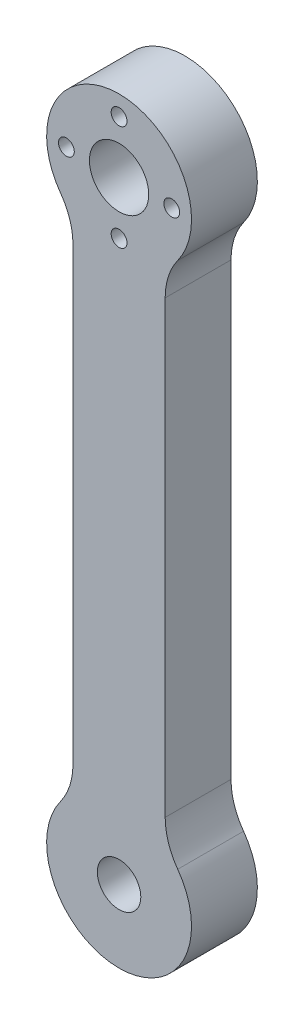
ISO-10303-21;
HEADER;
FILE_DESCRIPTION(('STEP AP214'),'2;1');
FILE_NAME('part.step','',(''),(''),'','','');
FILE_SCHEMA(('AUTOMOTIVE_DESIGN { 1 0 10303 214 1 1 1 1 }'));
ENDSEC;
DATA;
#1=APPLICATION_CONTEXT('core data for automotive mechanical design processes');
#2=APPLICATION_PROTOCOL_DEFINITION('international standard','automotive_design',2000,#1);
#3=PRODUCT_CONTEXT('',#1,'mechanical');
#4=PRODUCT('Part','Part','',(#3));
#5=PRODUCT_RELATED_PRODUCT_CATEGORY('part','',(#4));
#6=PRODUCT_DEFINITION_FORMATION('','',#4);
#7=PRODUCT_DEFINITION_CONTEXT('part definition',#1,'design');
#8=PRODUCT_DEFINITION('design','',#6,#7);
#9=PRODUCT_DEFINITION_SHAPE('','',#8);
#10=(LENGTH_UNIT() NAMED_UNIT(*) SI_UNIT(.MILLI.,.METRE.));
#11=(NAMED_UNIT(*) PLANE_ANGLE_UNIT() SI_UNIT($,.RADIAN.));
#12=(NAMED_UNIT(*) SI_UNIT($,.STERADIAN.) SOLID_ANGLE_UNIT());
#13=UNCERTAINTY_MEASURE_WITH_UNIT(LENGTH_MEASURE(1.E-05),#10,'distance_accuracy_value','');
#14=(GEOMETRIC_REPRESENTATION_CONTEXT(3) GLOBAL_UNCERTAINTY_ASSIGNED_CONTEXT((#13)) GLOBAL_UNIT_ASSIGNED_CONTEXT((#10,
#11,#12)) REPRESENTATION_CONTEXT('',''));
#15=CARTESIAN_POINT('',(0.,0.,0.));
#16=DIRECTION('',(0.,0.,1.));
#17=DIRECTION('',(1.,0.,0.));
#18=AXIS2_PLACEMENT_3D('',#15,#16,#17);
#19=CARTESIAN_POINT('',(0.,46.4852813742386,10.));
#20=DIRECTION('',(0.,0.,1.));
#21=DIRECTION('',(1.,0.,0.));
#22=AXIS2_PLACEMENT_3D('',#19,#20,#21);
#23=PLANE('',#22);
#24=CARTESIAN_POINT('',(0.,-46.4852813742386,10.));
#25=DIRECTION('',(0.,0.,1.));
#26=DIRECTION('',(1.,0.,0.));
#27=AXIS2_PLACEMENT_3D('',#24,#25,#26);
#28=CIRCLE('',#27,3.3);
#29=CARTESIAN_POINT('',(3.3,-46.4852813742386,10.));
#30=VERTEX_POINT('',#29);
#31=EDGE_CURVE('E373',#30,#30,#28,.T.);
#32=ORIENTED_EDGE('',*,*,#31,.F.);
#33=EDGE_LOOP('',(#32));
#34=FACE_BOUND('',#33,.T.);
#35=CARTESIAN_POINT('',(0.,54.4852813742386,10.));
#36=DIRECTION('',(0.,0.,1.));
#37=DIRECTION('',(1.,0.,0.));
#38=AXIS2_PLACEMENT_3D('',#35,#36,#37);
#39=CIRCLE('',#38,1.19999999999999);
#40=CARTESIAN_POINT('',(1.19999999999999,54.4852813742386,10.));
#41=VERTEX_POINT('',#40);
#42=EDGE_CURVE('E364',#41,#41,#39,.T.);
#43=ORIENTED_EDGE('',*,*,#42,.F.);
#44=EDGE_LOOP('',(#43));
#45=FACE_BOUND('',#44,.T.);
#46=CARTESIAN_POINT('',(8.,46.4852813742386,10.));
#47=DIRECTION('',(0.,0.,1.));
#48=DIRECTION('',(1.,0.,0.));
#49=AXIS2_PLACEMENT_3D('',#46,#47,#48);
#50=CIRCLE('',#49,1.19999999999999);
#51=CARTESIAN_POINT('',(9.19999999999999,46.4852813742386,10.));
#52=VERTEX_POINT('',#51);
#53=EDGE_CURVE('E370',#52,#52,#50,.T.);
#54=ORIENTED_EDGE('',*,*,#53,.F.);
#55=EDGE_LOOP('',(#54));
#56=FACE_BOUND('',#55,.T.);
#57=CARTESIAN_POINT('',(0.,38.4852813742386,10.));
#58=DIRECTION('',(0.,0.,1.));
#59=DIRECTION('',(1.,0.,0.));
#60=AXIS2_PLACEMENT_3D('',#57,#58,#59);
#61=CIRCLE('',#60,1.19999999999999);
#62=CARTESIAN_POINT('',(1.19999999999999,38.4852813742386,10.));
#63=VERTEX_POINT('',#62);
#64=EDGE_CURVE('E384',#63,#63,#61,.T.);
#65=ORIENTED_EDGE('',*,*,#64,.F.);
#66=EDGE_LOOP('',(#65));
#67=FACE_BOUND('',#66,.T.);
#68=CARTESIAN_POINT('',(-8.,46.4852813742386,10.));
#69=DIRECTION('',(0.,0.,1.));
#70=DIRECTION('',(1.,0.,0.));
#71=AXIS2_PLACEMENT_3D('',#68,#69,#70);
#72=CIRCLE('',#71,1.19999999999999);
#73=CARTESIAN_POINT('',(-6.80000000000001,46.4852813742386,10.));
#74=VERTEX_POINT('',#73);
#75=EDGE_CURVE('E392',#74,#74,#72,.T.);
#76=ORIENTED_EDGE('',*,*,#75,.F.);
#77=EDGE_LOOP('',(#76));
#78=FACE_BOUND('',#77,.T.);
#79=DIRECTION('',(0.,1.,0.));
#80=VECTOR('',#79,1.);
#81=CARTESIAN_POINT('',(6.99999999999998,38.,10.));
#82=LINE('',#81,#80);
#83=CARTESIAN_POINT('',(6.99999999999998,-34.1564533683006,10.));
#84=VERTEX_POINT('',#83);
#85=CARTESIAN_POINT('',(6.99999999999998,34.1564533683006,10.));
#86=VERTEX_POINT('',#85);
#87=EDGE_CURVE('E157',#84,#86,#82,.T.);
#88=ORIENTED_EDGE('',*,*,#87,.T.);
#89=CARTESIAN_POINT('',(17.,34.1564533683006,10.));
#90=DIRECTION('',(0.,0.,1.));
#91=DIRECTION('',(1.,0.,0.));
#92=AXIS2_PLACEMENT_3D('',#89,#90,#91);
#93=CIRCLE('',#92,10.);
#94=CARTESIAN_POINT('',(8.90476190476189,40.0273238473187,10.));
#95=VERTEX_POINT('',#94);
#96=EDGE_CURVE('E68',#86,#95,#93,.F.);
#97=ORIENTED_EDGE('',*,*,#96,.T.);
#98=CARTESIAN_POINT('',(0.,46.4852813742386,10.));
#99=DIRECTION('',(0.,0.,1.));
#100=DIRECTION('',(1.,0.,0.));
#101=AXIS2_PLACEMENT_3D('',#98,#99,#100);
#102=CIRCLE('',#101,11.);
#103=CARTESIAN_POINT('',(-8.90476190476189,40.0273238473187,10.));
#104=VERTEX_POINT('',#103);
#105=EDGE_CURVE('E150',#95,#104,#102,.T.);
#106=ORIENTED_EDGE('',*,*,#105,.T.);
#107=CARTESIAN_POINT('',(-17.,34.1564533683006,10.));
#108=DIRECTION('',(0.,0.,1.));
#109=DIRECTION('',(1.,0.,0.));
#110=AXIS2_PLACEMENT_3D('',#107,#108,#109);
#111=CIRCLE('',#110,10.);
#112=CARTESIAN_POINT('',(-6.99999999999998,34.1564533683006,10.));
#113=VERTEX_POINT('',#112);
#114=EDGE_CURVE('E11',#104,#113,#111,.F.);
#115=ORIENTED_EDGE('',*,*,#114,.T.);
#116=DIRECTION('',(0.,-1.,0.));
#117=VECTOR('',#116,1.);
#118=CARTESIAN_POINT('',(-6.99999999999998,38.,10.));
#119=LINE('',#118,#117);
#120=CARTESIAN_POINT('',(-6.99999999999998,-34.1564533683006,10.));
#121=VERTEX_POINT('',#120);
#122=EDGE_CURVE('E198',#113,#121,#119,.T.);
#123=ORIENTED_EDGE('',*,*,#122,.T.);
#124=CARTESIAN_POINT('',(-17.,-34.1564533683006,10.));
#125=DIRECTION('',(0.,0.,1.));
#126=DIRECTION('',(1.,0.,0.));
#127=AXIS2_PLACEMENT_3D('',#124,#125,#126);
#128=CIRCLE('',#127,10.);
#129=CARTESIAN_POINT('',(-8.90476190476189,-40.0273238473187,10.));
#130=VERTEX_POINT('',#129);
#131=EDGE_CURVE('E123',#121,#130,#128,.F.);
#132=ORIENTED_EDGE('',*,*,#131,.T.);
#133=CARTESIAN_POINT('',(0.,-46.4852813742386,10.));
#134=DIRECTION('',(0.,0.,1.));
#135=DIRECTION('',(-1.,0.,0.));
#136=AXIS2_PLACEMENT_3D('',#133,#134,#135);
#137=CIRCLE('',#136,11.);
#138=CARTESIAN_POINT('',(8.90476190476189,-40.0273238473187,10.));
#139=VERTEX_POINT('',#138);
#140=EDGE_CURVE('E133',#130,#139,#137,.T.);
#141=ORIENTED_EDGE('',*,*,#140,.T.);
#142=CARTESIAN_POINT('',(17.,-34.1564533683006,10.));
#143=DIRECTION('',(0.,0.,1.));
#144=DIRECTION('',(1.,0.,0.));
#145=AXIS2_PLACEMENT_3D('',#142,#143,#144);
#146=CIRCLE('',#145,10.);
#147=EDGE_CURVE('E180',#139,#84,#146,.F.);
#148=ORIENTED_EDGE('',*,*,#147,.T.);
#149=EDGE_LOOP('',(#88,#97,#106,#115,#123,#132,#141,#148));
#150=FACE_BOUND('',#149,.T.);
#151=CARTESIAN_POINT('',(0.,46.4852813742386,10.));
#152=DIRECTION('',(0.,0.,1.));
#153=DIRECTION('',(1.,0.,0.));
#154=AXIS2_PLACEMENT_3D('',#151,#152,#153);
#155=CIRCLE('',#154,4.50263545763704);
#156=CARTESIAN_POINT('',(4.50263545763704,46.4852813742386,10.));
#157=VERTEX_POINT('',#156);
#158=EDGE_CURVE('E193',#157,#157,#155,.T.);
#159=ORIENTED_EDGE('',*,*,#158,.F.);
#160=EDGE_LOOP('',(#159));
#161=FACE_BOUND('',#160,.T.);
#162=ADVANCED_FACE('F45',(#34,#45,#56,#67,#78,#150,#161),#23,.T.);
#163=CARTESIAN_POINT('',(0.,46.4852813742386,0.));
#164=DIRECTION('',(0.,0.,1.));
#165=DIRECTION('',(1.,0.,0.));
#166=AXIS2_PLACEMENT_3D('',#163,#164,#165);
#167=PLANE('',#166);
#168=CARTESIAN_POINT('',(0.,-46.4852813742386,0.));
#169=DIRECTION('',(0.,0.,1.));
#170=DIRECTION('',(1.,0.,0.));
#171=AXIS2_PLACEMENT_3D('',#168,#169,#170);
#172=CIRCLE('',#171,3.3);
#173=CARTESIAN_POINT('',(3.3,-46.4852813742386,0.));
#174=VERTEX_POINT('',#173);
#175=EDGE_CURVE('E366',#174,#174,#172,.T.);
#176=ORIENTED_EDGE('',*,*,#175,.T.);
#177=EDGE_LOOP('',(#176));
#178=FACE_BOUND('',#177,.T.);
#179=CARTESIAN_POINT('',(0.,54.4852813742386,0.));
#180=DIRECTION('',(0.,0.,1.));
#181=DIRECTION('',(1.,0.,0.));
#182=AXIS2_PLACEMENT_3D('',#179,#180,#181);
#183=CIRCLE('',#182,1.19999999999999);
#184=CARTESIAN_POINT('',(1.19999999999999,54.4852813742386,0.));
#185=VERTEX_POINT('',#184);
#186=EDGE_CURVE('E361',#185,#185,#183,.T.);
#187=ORIENTED_EDGE('',*,*,#186,.T.);
#188=EDGE_LOOP('',(#187));
#189=FACE_BOUND('',#188,.T.);
#190=CARTESIAN_POINT('',(8.,46.4852813742386,0.));
#191=DIRECTION('',(0.,0.,1.));
#192=DIRECTION('',(1.,0.,0.));
#193=AXIS2_PLACEMENT_3D('',#190,#191,#192);
#194=CIRCLE('',#193,1.19999999999999);
#195=CARTESIAN_POINT('',(9.19999999999999,46.4852813742386,0.));
#196=VERTEX_POINT('',#195);
#197=EDGE_CURVE('E380',#196,#196,#194,.T.);
#198=ORIENTED_EDGE('',*,*,#197,.T.);
#199=EDGE_LOOP('',(#198));
#200=FACE_BOUND('',#199,.T.);
#201=CARTESIAN_POINT('',(0.,38.4852813742386,0.));
#202=DIRECTION('',(0.,0.,1.));
#203=DIRECTION('',(1.,0.,0.));
#204=AXIS2_PLACEMENT_3D('',#201,#202,#203);
#205=CIRCLE('',#204,1.19999999999999);
#206=CARTESIAN_POINT('',(1.19999999999999,38.4852813742386,0.));
#207=VERTEX_POINT('',#206);
#208=EDGE_CURVE('E388',#207,#207,#205,.T.);
#209=ORIENTED_EDGE('',*,*,#208,.T.);
#210=EDGE_LOOP('',(#209));
#211=FACE_BOUND('',#210,.T.);
#212=CARTESIAN_POINT('',(-8.,46.4852813742386,0.));
#213=DIRECTION('',(0.,0.,1.));
#214=DIRECTION('',(1.,0.,0.));
#215=AXIS2_PLACEMENT_3D('',#212,#213,#214);
#216=CIRCLE('',#215,1.19999999999999);
#217=CARTESIAN_POINT('',(-6.80000000000001,46.4852813742386,0.));
#218=VERTEX_POINT('',#217);
#219=EDGE_CURVE('E396',#218,#218,#216,.T.);
#220=ORIENTED_EDGE('',*,*,#219,.T.);
#221=EDGE_LOOP('',(#220));
#222=FACE_BOUND('',#221,.T.);
#223=CARTESIAN_POINT('',(0.,46.4852813742386,0.));
#224=DIRECTION('',(0.,0.,1.));
#225=DIRECTION('',(1.,0.,0.));
#226=AXIS2_PLACEMENT_3D('',#223,#224,#225);
#227=CIRCLE('',#226,11.);
#228=CARTESIAN_POINT('',(8.90476190476189,40.0273238473187,0.));
#229=VERTEX_POINT('',#228);
#230=CARTESIAN_POINT('',(-8.90476190476189,40.0273238473187,0.));
#231=VERTEX_POINT('',#230);
#232=EDGE_CURVE('E152',#229,#231,#227,.T.);
#233=ORIENTED_EDGE('',*,*,#232,.F.);
#234=CARTESIAN_POINT('',(17.,34.1564533683006,0.));
#235=DIRECTION('',(0.,0.,1.));
#236=DIRECTION('',(1.,0.,0.));
#237=AXIS2_PLACEMENT_3D('',#234,#235,#236);
#238=CIRCLE('',#237,10.);
#239=CARTESIAN_POINT('',(6.99999999999998,34.1564533683006,0.));
#240=VERTEX_POINT('',#239);
#241=EDGE_CURVE('E183',#229,#240,#238,.T.);
#242=ORIENTED_EDGE('',*,*,#241,.T.);
#243=DIRECTION('',(0.,1.,0.));
#244=VECTOR('',#243,1.);
#245=CARTESIAN_POINT('',(6.99999999999998,38.,0.));
#246=LINE('',#245,#244);
#247=CARTESIAN_POINT('',(6.99999999999998,-34.1564533683006,0.));
#248=VERTEX_POINT('',#247);
#249=EDGE_CURVE('E144',#248,#240,#246,.T.);
#250=ORIENTED_EDGE('',*,*,#249,.F.);
#251=CARTESIAN_POINT('',(17.,-34.1564533683006,0.));
#252=DIRECTION('',(0.,0.,1.));
#253=DIRECTION('',(1.,0.,0.));
#254=AXIS2_PLACEMENT_3D('',#251,#252,#253);
#255=CIRCLE('',#254,10.);
#256=CARTESIAN_POINT('',(8.90476190476189,-40.0273238473187,0.));
#257=VERTEX_POINT('',#256);
#258=EDGE_CURVE('E142',#248,#257,#255,.T.);
#259=ORIENTED_EDGE('',*,*,#258,.T.);
#260=CARTESIAN_POINT('',(0.,-46.4852813742386,0.));
#261=DIRECTION('',(0.,0.,1.));
#262=DIRECTION('',(-1.,0.,0.));
#263=AXIS2_PLACEMENT_3D('',#260,#261,#262);
#264=CIRCLE('',#263,11.);
#265=CARTESIAN_POINT('',(-8.90476190476189,-40.0273238473187,0.));
#266=VERTEX_POINT('',#265);
#267=EDGE_CURVE('E130',#266,#257,#264,.T.);
#268=ORIENTED_EDGE('',*,*,#267,.F.);
#269=CARTESIAN_POINT('',(-17.,-34.1564533683006,0.));
#270=DIRECTION('',(0.,0.,1.));
#271=DIRECTION('',(1.,0.,0.));
#272=AXIS2_PLACEMENT_3D('',#269,#270,#271);
#273=CIRCLE('',#272,10.);
#274=CARTESIAN_POINT('',(-6.99999999999998,-34.1564533683006,0.));
#275=VERTEX_POINT('',#274);
#276=EDGE_CURVE('E112',#266,#275,#273,.T.);
#277=ORIENTED_EDGE('',*,*,#276,.T.);
#278=DIRECTION('',(0.,-1.,0.));
#279=VECTOR('',#278,1.);
#280=CARTESIAN_POINT('',(-6.99999999999998,38.,0.));
#281=LINE('',#280,#279);
#282=CARTESIAN_POINT('',(-6.99999999999998,34.1564533683006,0.));
#283=VERTEX_POINT('',#282);
#284=EDGE_CURVE('E145',#283,#275,#281,.T.);
#285=ORIENTED_EDGE('',*,*,#284,.F.);
#286=CARTESIAN_POINT('',(-17.,34.1564533683006,0.));
#287=DIRECTION('',(0.,0.,1.));
#288=DIRECTION('',(1.,0.,0.));
#289=AXIS2_PLACEMENT_3D('',#286,#287,#288);
#290=CIRCLE('',#289,10.);
#291=EDGE_CURVE('E54',#283,#231,#290,.T.);
#292=ORIENTED_EDGE('',*,*,#291,.T.);
#293=EDGE_LOOP('',(#233,#242,#250,#259,#268,#277,#285,#292));
#294=FACE_BOUND('',#293,.T.);
#295=CARTESIAN_POINT('',(0.,46.4852813742386,0.));
#296=DIRECTION('',(0.,0.,1.));
#297=DIRECTION('',(1.,0.,0.));
#298=AXIS2_PLACEMENT_3D('',#295,#296,#297);
#299=CIRCLE('',#298,4.50263545763704);
#300=CARTESIAN_POINT('',(4.50263545763704,46.4852813742386,0.));
#301=VERTEX_POINT('',#300);
#302=EDGE_CURVE('E400',#301,#301,#299,.T.);
#303=ORIENTED_EDGE('',*,*,#302,.T.);
#304=EDGE_LOOP('',(#303));
#305=FACE_BOUND('',#304,.T.);
#306=ADVANCED_FACE('F139',(#178,#189,#200,#211,#222,#294,#305),#167,.F.);
#307=CARTESIAN_POINT('',(0.,46.4852813742386,10.));
#308=DIRECTION('',(0.,0.,-1.));
#309=DIRECTION('',(-1.,0.,0.));
#310=AXIS2_PLACEMENT_3D('',#307,#308,#309);
#311=CYLINDRICAL_SURFACE('',#310,11.);
#312=ORIENTED_EDGE('',*,*,#105,.F.);
#313=DIRECTION('',(0.,0.,-1.));
#314=VECTOR('',#313,1.);
#315=CARTESIAN_POINT('',(8.90476190476189,40.0273238473187,10.));
#316=LINE('',#315,#314);
#317=EDGE_CURVE('E124',#95,#229,#316,.T.);
#318=ORIENTED_EDGE('',*,*,#317,.T.);
#319=ORIENTED_EDGE('',*,*,#232,.T.);
#320=DIRECTION('',(0.,0.,-1.));
#321=VECTOR('',#320,1.);
#322=CARTESIAN_POINT('',(-8.90476190476189,40.0273238473187,10.));
#323=LINE('',#322,#321);
#324=EDGE_CURVE('E61',#231,#104,#323,.F.);
#325=ORIENTED_EDGE('',*,*,#324,.T.);
#326=EDGE_LOOP('',(#312,#318,#319,#325));
#327=FACE_BOUND('',#326,.T.);
#328=ADVANCED_FACE('F190',(#327),#311,.T.);
#329=CARTESIAN_POINT('',(-6.99999999999998,38.,10.));
#330=DIRECTION('',(1.,0.,0.));
#331=DIRECTION('',(0.,1.,0.));
#332=AXIS2_PLACEMENT_3D('',#329,#330,#331);
#333=PLANE('',#332);
#334=ORIENTED_EDGE('',*,*,#284,.T.);
#335=DIRECTION('',(0.,0.,1.));
#336=VECTOR('',#335,1.);
#337=CARTESIAN_POINT('',(-6.99999999999998,-34.1564533683006,10.));
#338=LINE('',#337,#336);
#339=EDGE_CURVE('E117',#275,#121,#338,.T.);
#340=ORIENTED_EDGE('',*,*,#339,.T.);
#341=ORIENTED_EDGE('',*,*,#122,.F.);
#342=DIRECTION('',(0.,0.,1.));
#343=VECTOR('',#342,1.);
#344=CARTESIAN_POINT('',(-6.99999999999998,34.1564533683006,0.));
#345=LINE('',#344,#343);
#346=EDGE_CURVE('E135',#113,#283,#345,.F.);
#347=ORIENTED_EDGE('',*,*,#346,.T.);
#348=EDGE_LOOP('',(#334,#340,#341,#347));
#349=FACE_BOUND('',#348,.T.);
#350=ADVANCED_FACE('F200',(#349),#333,.F.);
#351=CARTESIAN_POINT('',(0.,-46.4852813742386,10.));
#352=DIRECTION('',(0.,0.,-1.));
#353=DIRECTION('',(-1.,0.,0.));
#354=AXIS2_PLACEMENT_3D('',#351,#352,#353);
#355=CYLINDRICAL_SURFACE('',#354,11.);
#356=ORIENTED_EDGE('',*,*,#140,.F.);
#357=DIRECTION('',(0.,0.,-1.));
#358=VECTOR('',#357,1.);
#359=CARTESIAN_POINT('',(-8.90476190476189,-40.0273238473187,10.));
#360=LINE('',#359,#358);
#361=EDGE_CURVE('E116',#130,#266,#360,.T.);
#362=ORIENTED_EDGE('',*,*,#361,.T.);
#363=ORIENTED_EDGE('',*,*,#267,.T.);
#364=DIRECTION('',(0.,0.,-1.));
#365=VECTOR('',#364,1.);
#366=CARTESIAN_POINT('',(8.90476190476189,-40.0273238473187,10.));
#367=LINE('',#366,#365);
#368=EDGE_CURVE('E136',#257,#139,#367,.F.);
#369=ORIENTED_EDGE('',*,*,#368,.T.);
#370=EDGE_LOOP('',(#356,#362,#363,#369));
#371=FACE_BOUND('',#370,.T.);
#372=ADVANCED_FACE('F129',(#371),#355,.T.);
#373=CARTESIAN_POINT('',(6.99999999999998,38.,10.));
#374=DIRECTION('',(-1.,0.,0.));
#375=DIRECTION('',(0.,0.,1.));
#376=AXIS2_PLACEMENT_3D('',#373,#374,#375);
#377=PLANE('',#376);
#378=ORIENTED_EDGE('',*,*,#87,.F.);
#379=DIRECTION('',(0.,0.,1.));
#380=VECTOR('',#379,1.);
#381=CARTESIAN_POINT('',(6.99999999999998,-34.1564533683006,0.));
#382=LINE('',#381,#380);
#383=EDGE_CURVE('E167',#84,#248,#382,.F.);
#384=ORIENTED_EDGE('',*,*,#383,.T.);
#385=ORIENTED_EDGE('',*,*,#249,.T.);
#386=DIRECTION('',(0.,0.,1.));
#387=VECTOR('',#386,1.);
#388=CARTESIAN_POINT('',(6.99999999999998,34.1564533683006,10.));
#389=LINE('',#388,#387);
#390=EDGE_CURVE('E164',#240,#86,#389,.T.);
#391=ORIENTED_EDGE('',*,*,#390,.T.);
#392=EDGE_LOOP('',(#378,#384,#385,#391));
#393=FACE_BOUND('',#392,.T.);
#394=ADVANCED_FACE('F217',(#393),#377,.F.);
#395=CARTESIAN_POINT('',(0.,46.4852813742386,10.));
#396=DIRECTION('',(0.,0.,-1.));
#397=DIRECTION('',(-1.,0.,0.));
#398=AXIS2_PLACEMENT_3D('',#395,#396,#397);
#399=CYLINDRICAL_SURFACE('',#398,4.50263545763704);
#400=ORIENTED_EDGE('',*,*,#158,.T.);
#401=EDGE_LOOP('',(#400));
#402=FACE_BOUND('',#401,.T.);
#403=ORIENTED_EDGE('',*,*,#302,.F.);
#404=EDGE_LOOP('',(#403));
#405=FACE_BOUND('',#404,.T.);
#406=ADVANCED_FACE('F240',(#402,#405),#399,.F.);
#407=CARTESIAN_POINT('',(-8.,46.4852813742386,10.));
#408=DIRECTION('',(0.,0.,1.));
#409=DIRECTION('',(1.,0.,0.));
#410=AXIS2_PLACEMENT_3D('',#407,#408,#409);
#411=CYLINDRICAL_SURFACE('',#410,1.19999999999999);
#412=ORIENTED_EDGE('',*,*,#219,.F.);
#413=EDGE_LOOP('',(#412));
#414=FACE_BOUND('',#413,.T.);
#415=ORIENTED_EDGE('',*,*,#75,.T.);
#416=EDGE_LOOP('',(#415));
#417=FACE_BOUND('',#416,.T.);
#418=ADVANCED_FACE('F329',(#414,#417),#411,.F.);
#419=CARTESIAN_POINT('',(0.,38.4852813742386,10.));
#420=DIRECTION('',(0.,0.,1.));
#421=DIRECTION('',(1.,0.,0.));
#422=AXIS2_PLACEMENT_3D('',#419,#420,#421);
#423=CYLINDRICAL_SURFACE('',#422,1.19999999999999);
#424=ORIENTED_EDGE('',*,*,#208,.F.);
#425=EDGE_LOOP('',(#424));
#426=FACE_BOUND('',#425,.T.);
#427=ORIENTED_EDGE('',*,*,#64,.T.);
#428=EDGE_LOOP('',(#427));
#429=FACE_BOUND('',#428,.T.);
#430=ADVANCED_FACE('F337',(#426,#429),#423,.F.);
#431=CARTESIAN_POINT('',(8.,46.4852813742386,10.));
#432=DIRECTION('',(0.,0.,1.));
#433=DIRECTION('',(1.,0.,0.));
#434=AXIS2_PLACEMENT_3D('',#431,#432,#433);
#435=CYLINDRICAL_SURFACE('',#434,1.19999999999999);
#436=ORIENTED_EDGE('',*,*,#197,.F.);
#437=EDGE_LOOP('',(#436));
#438=FACE_BOUND('',#437,.T.);
#439=ORIENTED_EDGE('',*,*,#53,.T.);
#440=EDGE_LOOP('',(#439));
#441=FACE_BOUND('',#440,.T.);
#442=ADVANCED_FACE('F345',(#438,#441),#435,.F.);
#443=CARTESIAN_POINT('',(0.,54.4852813742386,10.));
#444=DIRECTION('',(0.,0.,1.));
#445=DIRECTION('',(1.,0.,0.));
#446=AXIS2_PLACEMENT_3D('',#443,#444,#445);
#447=CYLINDRICAL_SURFACE('',#446,1.19999999999999);
#448=ORIENTED_EDGE('',*,*,#186,.F.);
#449=EDGE_LOOP('',(#448));
#450=FACE_BOUND('',#449,.T.);
#451=ORIENTED_EDGE('',*,*,#42,.T.);
#452=EDGE_LOOP('',(#451));
#453=FACE_BOUND('',#452,.T.);
#454=ADVANCED_FACE('F226',(#450,#453),#447,.F.);
#455=CARTESIAN_POINT('',(-17.,-34.1564533683006,10.));
#456=DIRECTION('',(0.,0.,-1.));
#457=DIRECTION('',(-1.,0.,0.));
#458=AXIS2_PLACEMENT_3D('',#455,#456,#457);
#459=CYLINDRICAL_SURFACE('',#458,10.);
#460=ORIENTED_EDGE('',*,*,#131,.F.);
#461=ORIENTED_EDGE('',*,*,#339,.F.);
#462=ORIENTED_EDGE('',*,*,#276,.F.);
#463=ORIENTED_EDGE('',*,*,#361,.F.);
#464=EDGE_LOOP('',(#460,#461,#462,#463));
#465=FACE_BOUND('',#464,.T.);
#466=ADVANCED_FACE('F115',(#465),#459,.F.);
#467=CARTESIAN_POINT('',(17.,-34.1564533683006,10.));
#468=DIRECTION('',(0.,0.,-1.));
#469=DIRECTION('',(-1.,0.,0.));
#470=AXIS2_PLACEMENT_3D('',#467,#468,#469);
#471=CYLINDRICAL_SURFACE('',#470,10.);
#472=ORIENTED_EDGE('',*,*,#147,.F.);
#473=ORIENTED_EDGE('',*,*,#368,.F.);
#474=ORIENTED_EDGE('',*,*,#258,.F.);
#475=ORIENTED_EDGE('',*,*,#383,.F.);
#476=EDGE_LOOP('',(#472,#473,#474,#475));
#477=FACE_BOUND('',#476,.T.);
#478=ADVANCED_FACE('F219',(#477),#471,.F.);
#479=CARTESIAN_POINT('',(17.,34.1564533683006,10.));
#480=DIRECTION('',(0.,0.,-1.));
#481=DIRECTION('',(-1.,0.,0.));
#482=AXIS2_PLACEMENT_3D('',#479,#480,#481);
#483=CYLINDRICAL_SURFACE('',#482,10.);
#484=ORIENTED_EDGE('',*,*,#96,.F.);
#485=ORIENTED_EDGE('',*,*,#390,.F.);
#486=ORIENTED_EDGE('',*,*,#241,.F.);
#487=ORIENTED_EDGE('',*,*,#317,.F.);
#488=EDGE_LOOP('',(#484,#485,#486,#487));
#489=FACE_BOUND('',#488,.T.);
#490=ADVANCED_FACE('F216',(#489),#483,.F.);
#491=CARTESIAN_POINT('',(-17.,34.1564533683006,10.));
#492=DIRECTION('',(0.,0.,-1.));
#493=DIRECTION('',(-1.,0.,0.));
#494=AXIS2_PLACEMENT_3D('',#491,#492,#493);
#495=CYLINDRICAL_SURFACE('',#494,10.);
#496=ORIENTED_EDGE('',*,*,#114,.F.);
#497=ORIENTED_EDGE('',*,*,#324,.F.);
#498=ORIENTED_EDGE('',*,*,#291,.F.);
#499=ORIENTED_EDGE('',*,*,#346,.F.);
#500=EDGE_LOOP('',(#496,#497,#498,#499));
#501=FACE_BOUND('',#500,.T.);
#502=ADVANCED_FACE('F47',(#501),#495,.F.);
#503=CARTESIAN_POINT('',(0.,-46.4852813742386,10.));
#504=DIRECTION('',(0.,0.,1.));
#505=DIRECTION('',(1.,0.,0.));
#506=AXIS2_PLACEMENT_3D('',#503,#504,#505);
#507=CYLINDRICAL_SURFACE('',#506,3.3);
#508=ORIENTED_EDGE('',*,*,#175,.F.);
#509=EDGE_LOOP('',(#508));
#510=FACE_BOUND('',#509,.T.);
#511=ORIENTED_EDGE('',*,*,#31,.T.);
#512=EDGE_LOOP('',(#511));
#513=FACE_BOUND('',#512,.T.);
#514=ADVANCED_FACE('F301',(#510,#513),#507,.F.);
#515=CLOSED_SHELL('',(#162,#306,#328,#350,#372,#394,#406,#418,#430,#442,#454,#466,#478,#490,
#502,#514));
#516=MANIFOLD_SOLID_BREP('B2',#515);
#517=ADVANCED_BREP_SHAPE_REPRESENTATION('',(#18,#516),#14);
#518=SHAPE_DEFINITION_REPRESENTATION(#9,#517);
ENDSEC;
END-ISO-10303-21;
